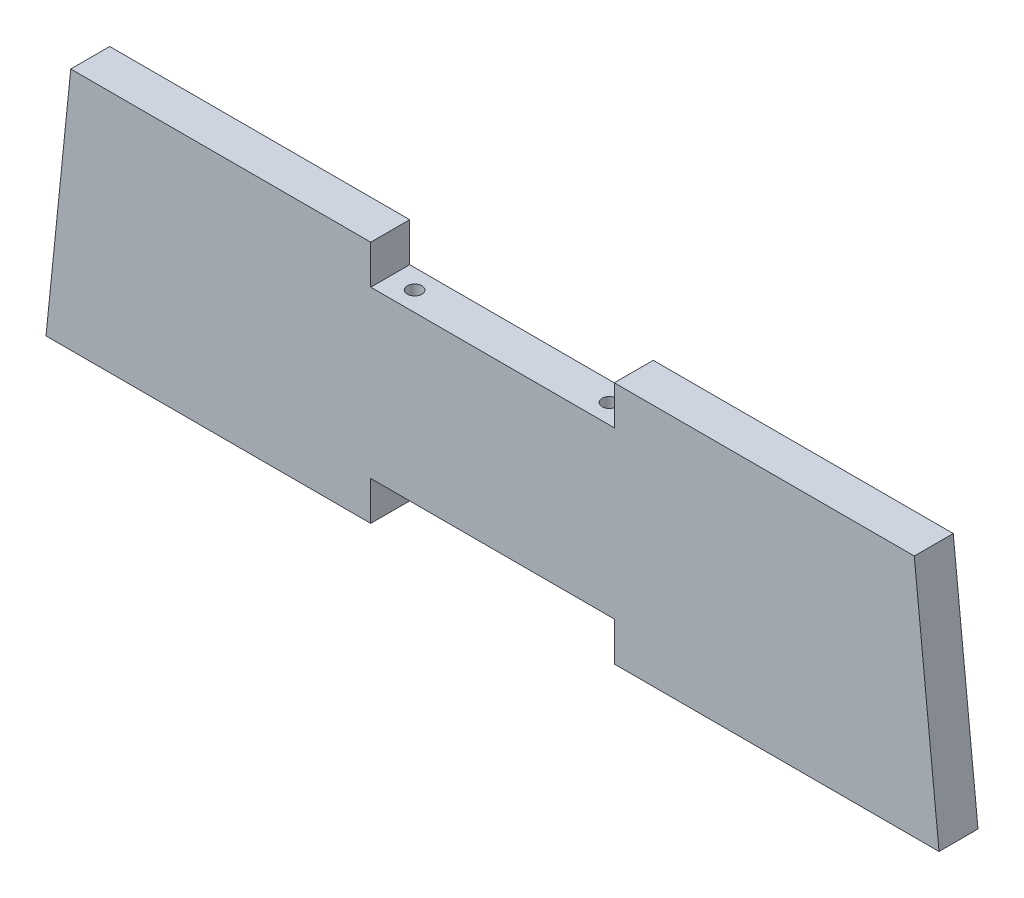
ISO-10303-21;
HEADER;
FILE_DESCRIPTION(('STEP AP214'),'2;1');
FILE_NAME('part.step','',(''),(''),'','','');
FILE_SCHEMA(('AUTOMOTIVE_DESIGN { 1 0 10303 214 1 1 1 1 }'));
ENDSEC;
DATA;
#1=APPLICATION_CONTEXT('core data for automotive mechanical design processes');
#2=APPLICATION_PROTOCOL_DEFINITION('international standard','automotive_design',2000,#1);
#3=PRODUCT_CONTEXT('',#1,'mechanical');
#4=PRODUCT('Part','Part','',(#3));
#5=PRODUCT_RELATED_PRODUCT_CATEGORY('part','',(#4));
#6=PRODUCT_DEFINITION_FORMATION('','',#4);
#7=PRODUCT_DEFINITION_CONTEXT('part definition',#1,'design');
#8=PRODUCT_DEFINITION('design','',#6,#7);
#9=PRODUCT_DEFINITION_SHAPE('','',#8);
#10=(LENGTH_UNIT() NAMED_UNIT(*) SI_UNIT(.MILLI.,.METRE.));
#11=(NAMED_UNIT(*) PLANE_ANGLE_UNIT() SI_UNIT($,.RADIAN.));
#12=(NAMED_UNIT(*) SI_UNIT($,.STERADIAN.) SOLID_ANGLE_UNIT());
#13=UNCERTAINTY_MEASURE_WITH_UNIT(LENGTH_MEASURE(1.E-05),#10,'distance_accuracy_value','');
#14=(GEOMETRIC_REPRESENTATION_CONTEXT(3) GLOBAL_UNCERTAINTY_ASSIGNED_CONTEXT((#13)) GLOBAL_UNIT_ASSIGNED_CONTEXT((#10,
#11,#12)) REPRESENTATION_CONTEXT('',''));
#15=CARTESIAN_POINT('',(0.,0.,0.));
#16=DIRECTION('',(0.,0.,1.));
#17=DIRECTION('',(1.,0.,0.));
#18=AXIS2_PLACEMENT_3D('',#15,#16,#17);
#19=CARTESIAN_POINT('',(91.6708829323086,0.,-4.));
#20=DIRECTION('',(0.,-1.,0.));
#21=DIRECTION('',(0.,0.,-1.));
#22=AXIS2_PLACEMENT_3D('',#19,#20,#21);
#23=PLANE('',#22);
#24=DIRECTION('',(0.,0.,1.));
#25=VECTOR('',#24,1.);
#26=CARTESIAN_POINT('',(-25.,0.,-54.6359556046887));
#27=LINE('',#26,#25);
#28=CARTESIAN_POINT('',(-25.,0.,-4.));
#29=VERTEX_POINT('',#28);
#30=CARTESIAN_POINT('',(-25.,0.,4.));
#31=VERTEX_POINT('',#30);
#32=EDGE_CURVE('E134',#29,#31,#27,.T.);
#33=ORIENTED_EDGE('',*,*,#32,.T.);
#34=DIRECTION('',(1.,0.,0.));
#35=VECTOR('',#34,1.);
#36=CARTESIAN_POINT('',(91.6708829323086,0.,4.));
#37=LINE('',#36,#35);
#38=CARTESIAN_POINT('',(-91.6708829323086,0.,4.));
#39=VERTEX_POINT('',#38);
#40=EDGE_CURVE('E199',#39,#31,#37,.T.);
#41=ORIENTED_EDGE('',*,*,#40,.F.);
#42=DIRECTION('',(0.,0.,1.));
#43=VECTOR('',#42,1.);
#44=CARTESIAN_POINT('',(-91.6708829323086,0.,-4.));
#45=LINE('',#44,#43);
#46=CARTESIAN_POINT('',(-91.6708829323086,0.,-4.));
#47=VERTEX_POINT('',#46);
#48=EDGE_CURVE('E45',#47,#39,#45,.T.);
#49=ORIENTED_EDGE('',*,*,#48,.F.);
#50=DIRECTION('',(1.,0.,0.));
#51=VECTOR('',#50,1.);
#52=CARTESIAN_POINT('',(91.6708829323086,0.,-4.));
#53=LINE('',#52,#51);
#54=EDGE_CURVE('E213',#47,#29,#53,.T.);
#55=ORIENTED_EDGE('',*,*,#54,.T.);
#56=EDGE_LOOP('',(#33,#41,#49,#55));
#57=FACE_BOUND('',#56,.T.);
#58=ADVANCED_FACE('F36',(#57),#23,.T.);
#59=CARTESIAN_POINT('',(-86.5920681414425,50.,-4.));
#60=DIRECTION('',(0.,1.,0.));
#61=DIRECTION('',(-1.,0.,0.));
#62=AXIS2_PLACEMENT_3D('',#59,#60,#61);
#63=PLANE('',#62);
#64=DIRECTION('',(0.,0.,1.));
#65=VECTOR('',#64,1.);
#66=CARTESIAN_POINT('',(-25.,50.,-54.6359556046887));
#67=LINE('',#66,#65);
#68=CARTESIAN_POINT('',(-25.,50.,-4.));
#69=VERTEX_POINT('',#68);
#70=CARTESIAN_POINT('',(-25.,50.,4.));
#71=VERTEX_POINT('',#70);
#72=EDGE_CURVE('E166',#69,#71,#67,.T.);
#73=ORIENTED_EDGE('',*,*,#72,.F.);
#74=DIRECTION('',(-1.,0.,0.));
#75=VECTOR('',#74,1.);
#76=CARTESIAN_POINT('',(-86.5920681414425,50.,-4.));
#77=LINE('',#76,#75);
#78=CARTESIAN_POINT('',(-86.5920681414425,50.,-4.));
#79=VERTEX_POINT('',#78);
#80=EDGE_CURVE('E205',#69,#79,#77,.T.);
#81=ORIENTED_EDGE('',*,*,#80,.T.);
#82=DIRECTION('',(0.,0.,1.));
#83=VECTOR('',#82,1.);
#84=CARTESIAN_POINT('',(-86.5920681414425,50.,-4.));
#85=LINE('',#84,#83);
#86=CARTESIAN_POINT('',(-86.5920681414425,50.,4.));
#87=VERTEX_POINT('',#86);
#88=EDGE_CURVE('E215',#79,#87,#85,.T.);
#89=ORIENTED_EDGE('',*,*,#88,.T.);
#90=DIRECTION('',(-1.,0.,0.));
#91=VECTOR('',#90,1.);
#92=CARTESIAN_POINT('',(-86.5920681414425,50.,4.));
#93=LINE('',#92,#91);
#94=EDGE_CURVE('E191',#71,#87,#93,.T.);
#95=ORIENTED_EDGE('',*,*,#94,.F.);
#96=EDGE_LOOP('',(#73,#81,#89,#95));
#97=FACE_BOUND('',#96,.T.);
#98=ADVANCED_FACE('F245',(#97),#63,.T.);
#99=CARTESIAN_POINT('',(86.5920681414425,50.,-4.));
#100=DIRECTION('',(0.994880708828789,0.10105629718294,0.));
#101=DIRECTION('',(-0.10105629718294,0.994880708828789,0.));
#102=AXIS2_PLACEMENT_3D('',#99,#100,#101);
#103=PLANE('',#102);
#104=DIRECTION('',(0.,0.,1.));
#105=VECTOR('',#104,1.);
#106=CARTESIAN_POINT('',(86.5920681414425,50.,-4.));
#107=LINE('',#106,#105);
#108=CARTESIAN_POINT('',(86.5920681414425,50.,-4.));
#109=VERTEX_POINT('',#108);
#110=CARTESIAN_POINT('',(86.5920681414425,50.,4.));
#111=VERTEX_POINT('',#110);
#112=EDGE_CURVE('E40',#109,#111,#107,.T.);
#113=ORIENTED_EDGE('',*,*,#112,.T.);
#114=DIRECTION('',(-0.10105629718294,0.994880708828789,0.));
#115=VECTOR('',#114,1.);
#116=CARTESIAN_POINT('',(86.5920681414425,50.,4.));
#117=LINE('',#116,#115);
#118=CARTESIAN_POINT('',(91.6708829323086,0.,4.));
#119=VERTEX_POINT('',#118);
#120=EDGE_CURVE('E188',#119,#111,#117,.T.);
#121=ORIENTED_EDGE('',*,*,#120,.F.);
#122=DIRECTION('',(0.,0.,1.));
#123=VECTOR('',#122,1.);
#124=CARTESIAN_POINT('',(91.6708829323086,0.,-4.));
#125=LINE('',#124,#123);
#126=CARTESIAN_POINT('',(91.6708829323086,0.,-4.));
#127=VERTEX_POINT('',#126);
#128=EDGE_CURVE('E11',#127,#119,#125,.T.);
#129=ORIENTED_EDGE('',*,*,#128,.F.);
#130=DIRECTION('',(-0.10105629718294,0.994880708828789,0.));
#131=VECTOR('',#130,1.);
#132=CARTESIAN_POINT('',(86.5920681414425,50.,-4.));
#133=LINE('',#132,#131);
#134=EDGE_CURVE('E202',#127,#109,#133,.T.);
#135=ORIENTED_EDGE('',*,*,#134,.T.);
#136=EDGE_LOOP('',(#113,#121,#129,#135));
#137=FACE_BOUND('',#136,.T.);
#138=ADVANCED_FACE('F38',(#137),#103,.T.);
#139=DIRECTION('',(0.,0.,1.));
#140=VECTOR('',#139,1.);
#141=CARTESIAN_POINT('',(25.,0.,-54.6359556046887));
#142=LINE('',#141,#140);
#143=CARTESIAN_POINT('',(25.,0.,-4.));
#144=VERTEX_POINT('',#143);
#145=CARTESIAN_POINT('',(25.,0.,4.));
#146=VERTEX_POINT('',#145);
#147=EDGE_CURVE('E53',#144,#146,#142,.T.);
#148=ORIENTED_EDGE('',*,*,#147,.F.);
#149=EDGE_CURVE('E212',#144,#127,#53,.T.);
#150=ORIENTED_EDGE('',*,*,#149,.T.);
#151=ORIENTED_EDGE('',*,*,#128,.T.);
#152=EDGE_CURVE('E198',#146,#119,#37,.T.);
#153=ORIENTED_EDGE('',*,*,#152,.F.);
#154=EDGE_LOOP('',(#148,#150,#151,#153));
#155=FACE_BOUND('',#154,.T.);
#156=ADVANCED_FACE('F234',(#155),#23,.T.);
#157=CARTESIAN_POINT('',(-86.5920681414425,50.,-4.));
#158=DIRECTION('',(-0.994880708828789,0.101056297182941,0.));
#159=DIRECTION('',(-0.101056297182941,-0.994880708828789,0.));
#160=AXIS2_PLACEMENT_3D('',#157,#158,#159);
#161=PLANE('',#160);
#162=ORIENTED_EDGE('',*,*,#48,.T.);
#163=DIRECTION('',(-0.101056297182941,-0.994880708828789,0.));
#164=VECTOR('',#163,1.);
#165=CARTESIAN_POINT('',(-86.5920681414425,50.,4.));
#166=LINE('',#165,#164);
#167=EDGE_CURVE('E195',#87,#39,#166,.T.);
#168=ORIENTED_EDGE('',*,*,#167,.F.);
#169=ORIENTED_EDGE('',*,*,#88,.F.);
#170=DIRECTION('',(-0.101056297182941,-0.994880708828789,0.));
#171=VECTOR('',#170,1.);
#172=CARTESIAN_POINT('',(-86.5920681414425,50.,-4.));
#173=LINE('',#172,#171);
#174=EDGE_CURVE('E209',#79,#47,#173,.T.);
#175=ORIENTED_EDGE('',*,*,#174,.T.);
#176=EDGE_LOOP('',(#162,#168,#169,#175));
#177=FACE_BOUND('',#176,.T.);
#178=ADVANCED_FACE('F247',(#177),#161,.T.);
#179=DIRECTION('',(0.,0.,1.));
#180=VECTOR('',#179,1.);
#181=CARTESIAN_POINT('',(25.,50.,-54.6359556046887));
#182=LINE('',#181,#180);
#183=CARTESIAN_POINT('',(25.,50.,-4.));
#184=VERTEX_POINT('',#183);
#185=CARTESIAN_POINT('',(25.,50.,4.));
#186=VERTEX_POINT('',#185);
#187=EDGE_CURVE('E174',#184,#186,#182,.T.);
#188=ORIENTED_EDGE('',*,*,#187,.T.);
#189=EDGE_CURVE('E192',#111,#186,#93,.T.);
#190=ORIENTED_EDGE('',*,*,#189,.F.);
#191=ORIENTED_EDGE('',*,*,#112,.F.);
#192=EDGE_CURVE('E206',#109,#184,#77,.T.);
#193=ORIENTED_EDGE('',*,*,#192,.T.);
#194=EDGE_LOOP('',(#188,#190,#191,#193));
#195=FACE_BOUND('',#194,.T.);
#196=ADVANCED_FACE('F228',(#195),#63,.T.);
#197=CARTESIAN_POINT('',(0.,0.,-4.));
#198=DIRECTION('',(0.,0.,-1.));
#199=DIRECTION('',(-1.,0.,0.));
#200=AXIS2_PLACEMENT_3D('',#197,#198,#199);
#201=PLANE('',#200);
#202=DIRECTION('',(0.,-1.,0.));
#203=VECTOR('',#202,1.);
#204=CARTESIAN_POINT('',(-25.,0.,-4.));
#205=LINE('',#204,#203);
#206=CARTESIAN_POINT('',(-25.,8.,-4.));
#207=VERTEX_POINT('',#206);
#208=EDGE_CURVE('E128',#207,#29,#205,.T.);
#209=ORIENTED_EDGE('',*,*,#208,.T.);
#210=ORIENTED_EDGE('',*,*,#54,.F.);
#211=ORIENTED_EDGE('',*,*,#174,.F.);
#212=ORIENTED_EDGE('',*,*,#80,.F.);
#213=DIRECTION('',(0.,-1.,0.));
#214=VECTOR('',#213,1.);
#215=CARTESIAN_POINT('',(-25.,42.,-4.));
#216=LINE('',#215,#214);
#217=CARTESIAN_POINT('',(-25.,42.,-4.));
#218=VERTEX_POINT('',#217);
#219=EDGE_CURVE('E180',#69,#218,#216,.T.);
#220=ORIENTED_EDGE('',*,*,#219,.T.);
#221=DIRECTION('',(1.,0.,0.));
#222=VECTOR('',#221,1.);
#223=CARTESIAN_POINT('',(25.,42.,-4.));
#224=LINE('',#223,#222);
#225=CARTESIAN_POINT('',(25.,42.,-4.));
#226=VERTEX_POINT('',#225);
#227=EDGE_CURVE('E176',#218,#226,#224,.T.);
#228=ORIENTED_EDGE('',*,*,#227,.T.);
#229=DIRECTION('',(0.,1.,0.));
#230=VECTOR('',#229,1.);
#231=CARTESIAN_POINT('',(25.,42.,-4.));
#232=LINE('',#231,#230);
#233=EDGE_CURVE('E171',#226,#184,#232,.T.);
#234=ORIENTED_EDGE('',*,*,#233,.T.);
#235=ORIENTED_EDGE('',*,*,#192,.F.);
#236=ORIENTED_EDGE('',*,*,#134,.F.);
#237=ORIENTED_EDGE('',*,*,#149,.F.);
#238=DIRECTION('',(0.,1.,0.));
#239=VECTOR('',#238,1.);
#240=CARTESIAN_POINT('',(25.,0.,-4.));
#241=LINE('',#240,#239);
#242=CARTESIAN_POINT('',(25.,8.00000000000001,-4.));
#243=VERTEX_POINT('',#242);
#244=EDGE_CURVE('E151',#144,#243,#241,.T.);
#245=ORIENTED_EDGE('',*,*,#244,.T.);
#246=DIRECTION('',(-1.,0.,0.));
#247=VECTOR('',#246,1.);
#248=CARTESIAN_POINT('',(-25.,8.,-4.));
#249=LINE('',#248,#247);
#250=EDGE_CURVE('E142',#243,#207,#249,.T.);
#251=ORIENTED_EDGE('',*,*,#250,.T.);
#252=EDGE_LOOP('',(#209,#210,#211,#212,#220,#228,#234,#235,#236,#237,#245,#251));
#253=FACE_BOUND('',#252,.T.);
#254=ADVANCED_FACE('F149',(#253),#201,.T.);
#255=CARTESIAN_POINT('',(0.,0.,4.));
#256=DIRECTION('',(0.,0.,-1.));
#257=DIRECTION('',(-1.,0.,0.));
#258=AXIS2_PLACEMENT_3D('',#255,#256,#257);
#259=PLANE('',#258);
#260=ORIENTED_EDGE('',*,*,#40,.T.);
#261=DIRECTION('',(0.,-1.,0.));
#262=VECTOR('',#261,1.);
#263=CARTESIAN_POINT('',(-25.,0.,4.));
#264=LINE('',#263,#262);
#265=CARTESIAN_POINT('',(-25.,8.,4.));
#266=VERTEX_POINT('',#265);
#267=EDGE_CURVE('E152',#266,#31,#264,.T.);
#268=ORIENTED_EDGE('',*,*,#267,.F.);
#269=DIRECTION('',(-1.,0.,0.));
#270=VECTOR('',#269,1.);
#271=CARTESIAN_POINT('',(-25.,8.,4.));
#272=LINE('',#271,#270);
#273=CARTESIAN_POINT('',(25.,8.00000000000001,4.));
#274=VERTEX_POINT('',#273);
#275=EDGE_CURVE('E145',#274,#266,#272,.T.);
#276=ORIENTED_EDGE('',*,*,#275,.F.);
#277=DIRECTION('',(0.,1.,0.));
#278=VECTOR('',#277,1.);
#279=CARTESIAN_POINT('',(25.,0.,4.));
#280=LINE('',#279,#278);
#281=EDGE_CURVE('E157',#146,#274,#280,.T.);
#282=ORIENTED_EDGE('',*,*,#281,.F.);
#283=ORIENTED_EDGE('',*,*,#152,.T.);
#284=ORIENTED_EDGE('',*,*,#120,.T.);
#285=ORIENTED_EDGE('',*,*,#189,.T.);
#286=DIRECTION('',(0.,1.,0.));
#287=VECTOR('',#286,1.);
#288=CARTESIAN_POINT('',(25.,42.,4.));
#289=LINE('',#288,#287);
#290=CARTESIAN_POINT('',(25.,42.,4.));
#291=VERTEX_POINT('',#290);
#292=EDGE_CURVE('E164',#291,#186,#289,.T.);
#293=ORIENTED_EDGE('',*,*,#292,.F.);
#294=DIRECTION('',(1.,0.,0.));
#295=VECTOR('',#294,1.);
#296=CARTESIAN_POINT('',(25.,42.,4.));
#297=LINE('',#296,#295);
#298=CARTESIAN_POINT('',(-25.,42.,4.));
#299=VERTEX_POINT('',#298);
#300=EDGE_CURVE('E61',#299,#291,#297,.T.);
#301=ORIENTED_EDGE('',*,*,#300,.F.);
#302=DIRECTION('',(0.,-1.,0.));
#303=VECTOR('',#302,1.);
#304=CARTESIAN_POINT('',(-25.,42.,4.));
#305=LINE('',#304,#303);
#306=EDGE_CURVE('E167',#71,#299,#305,.T.);
#307=ORIENTED_EDGE('',*,*,#306,.F.);
#308=ORIENTED_EDGE('',*,*,#94,.T.);
#309=ORIENTED_EDGE('',*,*,#167,.T.);
#310=EDGE_LOOP('',(#260,#268,#276,#282,#283,#284,#285,#293,#301,#307,#308,#309));
#311=FACE_BOUND('',#310,.T.);
#312=ADVANCED_FACE('F231',(#311),#259,.F.);
#313=CARTESIAN_POINT('',(-25.,42.,-54.6359556046887));
#314=DIRECTION('',(-1.,0.,0.));
#315=DIRECTION('',(0.,0.,1.));
#316=AXIS2_PLACEMENT_3D('',#313,#314,#315);
#317=PLANE('',#316);
#318=ORIENTED_EDGE('',*,*,#72,.T.);
#319=ORIENTED_EDGE('',*,*,#306,.T.);
#320=DIRECTION('',(0.,0.,1.));
#321=VECTOR('',#320,1.);
#322=CARTESIAN_POINT('',(-25.,42.,-54.6359556046887));
#323=LINE('',#322,#321);
#324=EDGE_CURVE('E179',#218,#299,#323,.T.);
#325=ORIENTED_EDGE('',*,*,#324,.F.);
#326=ORIENTED_EDGE('',*,*,#219,.F.);
#327=EDGE_LOOP('',(#318,#319,#325,#326));
#328=FACE_BOUND('',#327,.T.);
#329=ADVANCED_FACE('F240',(#328),#317,.F.);
#330=CARTESIAN_POINT('',(25.,42.,-54.6359556046887));
#331=DIRECTION('',(0.,-1.,0.));
#332=DIRECTION('',(1.,0.,0.));
#333=AXIS2_PLACEMENT_3D('',#330,#331,#332);
#334=PLANE('',#333);
#335=CARTESIAN_POINT('',(-20.,42.,0.));
#336=DIRECTION('',(0.,1.,0.));
#337=DIRECTION('',(-1.,0.,0.));
#338=AXIS2_PLACEMENT_3D('',#335,#336,#337);
#339=CIRCLE('',#338,1.5);
#340=CARTESIAN_POINT('',(-21.5,42.,0.));
#341=VERTEX_POINT('',#340);
#342=EDGE_CURVE('E447',#341,#341,#339,.T.);
#343=ORIENTED_EDGE('',*,*,#342,.F.);
#344=EDGE_LOOP('',(#343));
#345=FACE_BOUND('',#344,.T.);
#346=CARTESIAN_POINT('',(20.,42.,0.));
#347=DIRECTION('',(0.,1.,0.));
#348=DIRECTION('',(-1.,0.,0.));
#349=AXIS2_PLACEMENT_3D('',#346,#347,#348);
#350=CIRCLE('',#349,1.5);
#351=CARTESIAN_POINT('',(18.5,42.,0.));
#352=VERTEX_POINT('',#351);
#353=EDGE_CURVE('E452',#352,#352,#350,.T.);
#354=ORIENTED_EDGE('',*,*,#353,.F.);
#355=EDGE_LOOP('',(#354));
#356=FACE_BOUND('',#355,.T.);
#357=ORIENTED_EDGE('',*,*,#324,.T.);
#358=ORIENTED_EDGE('',*,*,#300,.T.);
#359=DIRECTION('',(0.,0.,1.));
#360=VECTOR('',#359,1.);
#361=CARTESIAN_POINT('',(25.,42.,-54.6359556046887));
#362=LINE('',#361,#360);
#363=EDGE_CURVE('E175',#226,#291,#362,.T.);
#364=ORIENTED_EDGE('',*,*,#363,.F.);
#365=ORIENTED_EDGE('',*,*,#227,.F.);
#366=EDGE_LOOP('',(#357,#358,#364,#365));
#367=FACE_BOUND('',#366,.T.);
#368=ADVANCED_FACE('F237',(#345,#356,#367),#334,.F.);
#369=CARTESIAN_POINT('',(25.,42.,-54.6359556046887));
#370=DIRECTION('',(1.,0.,0.));
#371=DIRECTION('',(0.,0.,-1.));
#372=AXIS2_PLACEMENT_3D('',#369,#370,#371);
#373=PLANE('',#372);
#374=ORIENTED_EDGE('',*,*,#363,.T.);
#375=ORIENTED_EDGE('',*,*,#292,.T.);
#376=ORIENTED_EDGE('',*,*,#187,.F.);
#377=ORIENTED_EDGE('',*,*,#233,.F.);
#378=EDGE_LOOP('',(#374,#375,#376,#377));
#379=FACE_BOUND('',#378,.T.);
#380=ADVANCED_FACE('F236',(#379),#373,.F.);
#381=CARTESIAN_POINT('',(-25.,8.,-54.6359556046887));
#382=DIRECTION('',(0.,1.,0.));
#383=DIRECTION('',(-1.,0.,0.));
#384=AXIS2_PLACEMENT_3D('',#381,#382,#383);
#385=PLANE('',#384);
#386=CARTESIAN_POINT('',(-20.,8.,0.));
#387=DIRECTION('',(0.,-1.,0.));
#388=DIRECTION('',(1.,0.,0.));
#389=AXIS2_PLACEMENT_3D('',#386,#387,#388);
#390=CIRCLE('',#389,1.5);
#391=CARTESIAN_POINT('',(-18.5,8.,0.));
#392=VERTEX_POINT('',#391);
#393=EDGE_CURVE('E438',#392,#392,#390,.T.);
#394=ORIENTED_EDGE('',*,*,#393,.F.);
#395=EDGE_LOOP('',(#394));
#396=FACE_BOUND('',#395,.T.);
#397=CARTESIAN_POINT('',(20.,8.00000000000001,0.));
#398=DIRECTION('',(0.,-1.,0.));
#399=DIRECTION('',(1.,0.,0.));
#400=AXIS2_PLACEMENT_3D('',#397,#398,#399);
#401=CIRCLE('',#400,1.5);
#402=CARTESIAN_POINT('',(21.5,8.00000000000001,0.));
#403=VERTEX_POINT('',#402);
#404=EDGE_CURVE('E437',#403,#403,#401,.T.);
#405=ORIENTED_EDGE('',*,*,#404,.F.);
#406=EDGE_LOOP('',(#405));
#407=FACE_BOUND('',#406,.T.);
#408=DIRECTION('',(0.,0.,1.));
#409=VECTOR('',#408,1.);
#410=CARTESIAN_POINT('',(25.,8.00000000000001,-54.6359556046887));
#411=LINE('',#410,#409);
#412=EDGE_CURVE('E159',#243,#274,#411,.T.);
#413=ORIENTED_EDGE('',*,*,#412,.T.);
#414=ORIENTED_EDGE('',*,*,#275,.T.);
#415=DIRECTION('',(0.,0.,1.));
#416=VECTOR('',#415,1.);
#417=CARTESIAN_POINT('',(-25.,8.,-54.6359556046887));
#418=LINE('',#417,#416);
#419=EDGE_CURVE('E131',#207,#266,#418,.T.);
#420=ORIENTED_EDGE('',*,*,#419,.F.);
#421=ORIENTED_EDGE('',*,*,#250,.F.);
#422=EDGE_LOOP('',(#413,#414,#420,#421));
#423=FACE_BOUND('',#422,.T.);
#424=ADVANCED_FACE('F141',(#396,#407,#423),#385,.F.);
#425=CARTESIAN_POINT('',(-25.,0.,-54.6359556046887));
#426=DIRECTION('',(-1.,0.,0.));
#427=DIRECTION('',(0.,0.,1.));
#428=AXIS2_PLACEMENT_3D('',#425,#426,#427);
#429=PLANE('',#428);
#430=ORIENTED_EDGE('',*,*,#419,.T.);
#431=ORIENTED_EDGE('',*,*,#267,.T.);
#432=ORIENTED_EDGE('',*,*,#32,.F.);
#433=ORIENTED_EDGE('',*,*,#208,.F.);
#434=EDGE_LOOP('',(#430,#431,#432,#433));
#435=FACE_BOUND('',#434,.T.);
#436=ADVANCED_FACE('F130',(#435),#429,.F.);
#437=CARTESIAN_POINT('',(25.,0.,-54.6359556046887));
#438=DIRECTION('',(1.,0.,0.));
#439=DIRECTION('',(0.,0.,-1.));
#440=AXIS2_PLACEMENT_3D('',#437,#438,#439);
#441=PLANE('',#440);
#442=ORIENTED_EDGE('',*,*,#147,.T.);
#443=ORIENTED_EDGE('',*,*,#281,.T.);
#444=ORIENTED_EDGE('',*,*,#412,.F.);
#445=ORIENTED_EDGE('',*,*,#244,.F.);
#446=EDGE_LOOP('',(#442,#443,#444,#445));
#447=FACE_BOUND('',#446,.T.);
#448=ADVANCED_FACE('F328',(#447),#441,.F.);
#449=CARTESIAN_POINT('',(20.,32.,0.));
#450=DIRECTION('',(0.,1.,0.));
#451=DIRECTION('',(-1.,0.,0.));
#452=AXIS2_PLACEMENT_3D('',#449,#450,#451);
#453=CYLINDRICAL_SURFACE('',#452,1.5);
#454=CARTESIAN_POINT('',(20.,32.,0.));
#455=DIRECTION('',(0.,1.,0.));
#456=DIRECTION('',(-1.,0.,0.));
#457=AXIS2_PLACEMENT_3D('',#454,#455,#456);
#458=CIRCLE('',#457,1.5);
#459=CARTESIAN_POINT('',(18.5,32.,0.));
#460=VERTEX_POINT('',#459);
#461=EDGE_CURVE('E455',#460,#460,#458,.T.);
#462=ORIENTED_EDGE('',*,*,#461,.F.);
#463=EDGE_LOOP('',(#462));
#464=FACE_BOUND('',#463,.T.);
#465=ORIENTED_EDGE('',*,*,#353,.T.);
#466=EDGE_LOOP('',(#465));
#467=FACE_BOUND('',#466,.T.);
#468=ADVANCED_FACE('F337',(#464,#467),#453,.F.);
#469=CARTESIAN_POINT('',(20.,32.,0.));
#470=DIRECTION('',(0.,1.,0.));
#471=DIRECTION('',(-1.,0.,0.));
#472=AXIS2_PLACEMENT_3D('',#469,#470,#471);
#473=PLANE('',#472);
#474=ORIENTED_EDGE('',*,*,#461,.T.);
#475=EDGE_LOOP('',(#474));
#476=FACE_BOUND('',#475,.T.);
#477=ADVANCED_FACE('F353',(#476),#473,.T.);
#478=CARTESIAN_POINT('',(-20.,32.,0.));
#479=DIRECTION('',(0.,1.,0.));
#480=DIRECTION('',(-1.,0.,0.));
#481=AXIS2_PLACEMENT_3D('',#478,#479,#480);
#482=CYLINDRICAL_SURFACE('',#481,1.5);
#483=CARTESIAN_POINT('',(-20.,32.,0.));
#484=DIRECTION('',(0.,1.,0.));
#485=DIRECTION('',(-1.,0.,0.));
#486=AXIS2_PLACEMENT_3D('',#483,#484,#485);
#487=CIRCLE('',#486,1.5);
#488=CARTESIAN_POINT('',(-21.5,32.,0.));
#489=VERTEX_POINT('',#488);
#490=EDGE_CURVE('E449',#489,#489,#487,.T.);
#491=ORIENTED_EDGE('',*,*,#490,.F.);
#492=EDGE_LOOP('',(#491));
#493=FACE_BOUND('',#492,.T.);
#494=ORIENTED_EDGE('',*,*,#342,.T.);
#495=EDGE_LOOP('',(#494));
#496=FACE_BOUND('',#495,.T.);
#497=ADVANCED_FACE('F363',(#493,#496),#482,.F.);
#498=CARTESIAN_POINT('',(-20.,32.,0.));
#499=DIRECTION('',(0.,1.,0.));
#500=DIRECTION('',(-1.,0.,0.));
#501=AXIS2_PLACEMENT_3D('',#498,#499,#500);
#502=PLANE('',#501);
#503=ORIENTED_EDGE('',*,*,#490,.T.);
#504=EDGE_LOOP('',(#503));
#505=FACE_BOUND('',#504,.T.);
#506=ADVANCED_FACE('F373',(#505),#502,.T.);
#507=CARTESIAN_POINT('',(20.,18.,0.));
#508=DIRECTION('',(0.,-1.,0.));
#509=DIRECTION('',(1.,0.,0.));
#510=AXIS2_PLACEMENT_3D('',#507,#508,#509);
#511=CYLINDRICAL_SURFACE('',#510,1.5);
#512=CARTESIAN_POINT('',(20.,18.,0.));
#513=DIRECTION('',(0.,-1.,0.));
#514=DIRECTION('',(1.,0.,0.));
#515=AXIS2_PLACEMENT_3D('',#512,#513,#514);
#516=CIRCLE('',#515,1.5);
#517=CARTESIAN_POINT('',(21.5,18.,0.));
#518=VERTEX_POINT('',#517);
#519=EDGE_CURVE('E441',#518,#518,#516,.T.);
#520=ORIENTED_EDGE('',*,*,#519,.F.);
#521=EDGE_LOOP('',(#520));
#522=FACE_BOUND('',#521,.T.);
#523=ORIENTED_EDGE('',*,*,#404,.T.);
#524=EDGE_LOOP('',(#523));
#525=FACE_BOUND('',#524,.T.);
#526=ADVANCED_FACE('F383',(#522,#525),#511,.F.);
#527=CARTESIAN_POINT('',(20.,18.,0.));
#528=DIRECTION('',(0.,-1.,0.));
#529=DIRECTION('',(1.,0.,0.));
#530=AXIS2_PLACEMENT_3D('',#527,#528,#529);
#531=PLANE('',#530);
#532=ORIENTED_EDGE('',*,*,#519,.T.);
#533=EDGE_LOOP('',(#532));
#534=FACE_BOUND('',#533,.T.);
#535=ADVANCED_FACE('F400',(#534),#531,.T.);
#536=CARTESIAN_POINT('',(-20.,18.,0.));
#537=DIRECTION('',(0.,-1.,0.));
#538=DIRECTION('',(1.,0.,0.));
#539=AXIS2_PLACEMENT_3D('',#536,#537,#538);
#540=CYLINDRICAL_SURFACE('',#539,1.5);
#541=CARTESIAN_POINT('',(-20.,18.,0.));
#542=DIRECTION('',(0.,-1.,0.));
#543=DIRECTION('',(1.,0.,0.));
#544=AXIS2_PLACEMENT_3D('',#541,#542,#543);
#545=CIRCLE('',#544,1.5);
#546=CARTESIAN_POINT('',(-18.5,18.,0.));
#547=VERTEX_POINT('',#546);
#548=EDGE_CURVE('E436',#547,#547,#545,.T.);
#549=ORIENTED_EDGE('',*,*,#548,.F.);
#550=EDGE_LOOP('',(#549));
#551=FACE_BOUND('',#550,.T.);
#552=ORIENTED_EDGE('',*,*,#393,.T.);
#553=EDGE_LOOP('',(#552));
#554=FACE_BOUND('',#553,.T.);
#555=ADVANCED_FACE('F410',(#551,#554),#540,.F.);
#556=CARTESIAN_POINT('',(-20.,18.,0.));
#557=DIRECTION('',(0.,-1.,0.));
#558=DIRECTION('',(1.,0.,0.));
#559=AXIS2_PLACEMENT_3D('',#556,#557,#558);
#560=PLANE('',#559);
#561=ORIENTED_EDGE('',*,*,#548,.T.);
#562=EDGE_LOOP('',(#561));
#563=FACE_BOUND('',#562,.T.);
#564=ADVANCED_FACE('F420',(#563),#560,.T.);
#565=CLOSED_SHELL('',(#58,#98,#138,#156,#178,#196,#254,#312,#329,#368,#380,#424,#436,#448,#468,
#477,#497,#506,#526,#535,#555,#564));
#566=MANIFOLD_SOLID_BREP('B2',#565);
#567=ADVANCED_BREP_SHAPE_REPRESENTATION('',(#18,#566),#14);
#568=SHAPE_DEFINITION_REPRESENTATION(#9,#567);
ENDSEC;
END-ISO-10303-21;
